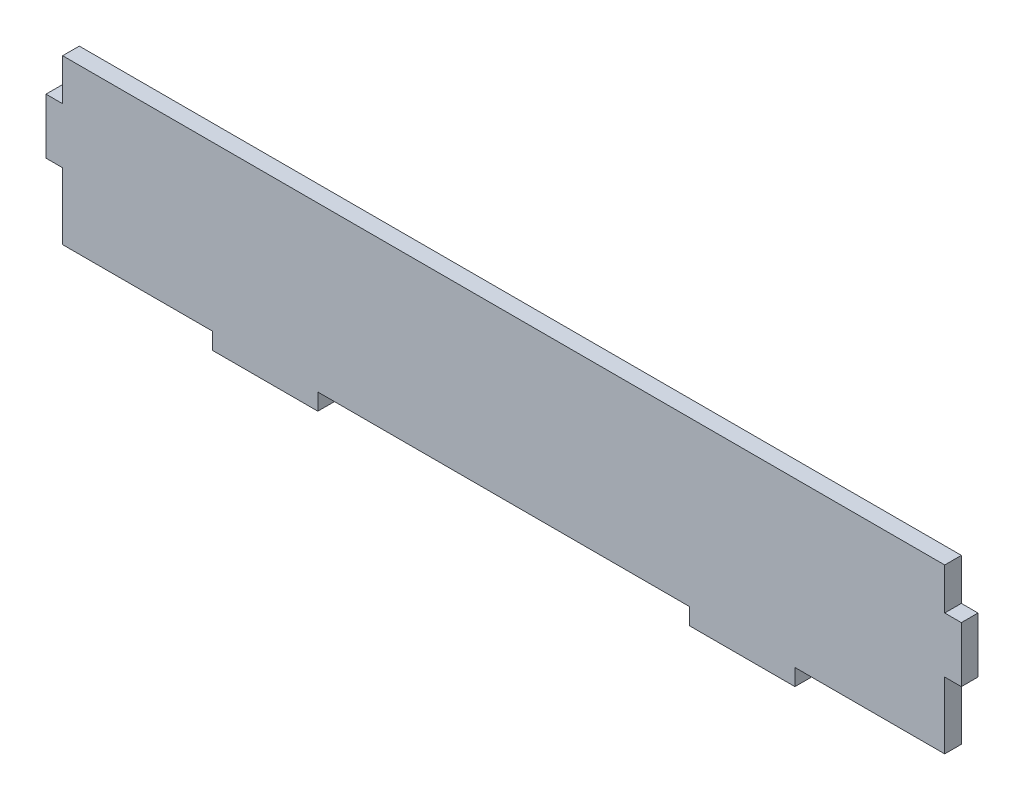
ISO-10303-21;
HEADER;
FILE_DESCRIPTION(('STEP AP214'),'2;1');
FILE_NAME('part.step','',(''),(''),'','','');
FILE_SCHEMA(('AUTOMOTIVE_DESIGN { 1 0 10303 214 1 1 1 1 }'));
ENDSEC;
DATA;
#1=APPLICATION_CONTEXT('core data for automotive mechanical design processes');
#2=APPLICATION_PROTOCOL_DEFINITION('international standard','automotive_design',2000,#1);
#3=PRODUCT_CONTEXT('',#1,'mechanical');
#4=PRODUCT('Part','Part','',(#3));
#5=PRODUCT_RELATED_PRODUCT_CATEGORY('part','',(#4));
#6=PRODUCT_DEFINITION_FORMATION('','',#4);
#7=PRODUCT_DEFINITION_CONTEXT('part definition',#1,'design');
#8=PRODUCT_DEFINITION('design','',#6,#7);
#9=PRODUCT_DEFINITION_SHAPE('','',#8);
#10=(LENGTH_UNIT() NAMED_UNIT(*) SI_UNIT(.MILLI.,.METRE.));
#11=(NAMED_UNIT(*) PLANE_ANGLE_UNIT() SI_UNIT($,.RADIAN.));
#12=(NAMED_UNIT(*) SI_UNIT($,.STERADIAN.) SOLID_ANGLE_UNIT());
#13=UNCERTAINTY_MEASURE_WITH_UNIT(LENGTH_MEASURE(1.E-05),#10,'distance_accuracy_value','');
#14=(GEOMETRIC_REPRESENTATION_CONTEXT(3) GLOBAL_UNCERTAINTY_ASSIGNED_CONTEXT((#13)) GLOBAL_UNIT_ASSIGNED_CONTEXT((#10,
#11,#12)) REPRESENTATION_CONTEXT('',''));
#15=CARTESIAN_POINT('',(0.,0.,0.));
#16=DIRECTION('',(0.,0.,1.));
#17=DIRECTION('',(1.,0.,0.));
#18=AXIS2_PLACEMENT_3D('',#15,#16,#17);
#19=CARTESIAN_POINT('',(0.,0.,6.));
#20=DIRECTION('',(0.,1.,0.));
#21=DIRECTION('',(0.,0.,1.));
#22=AXIS2_PLACEMENT_3D('',#19,#20,#21);
#23=PLANE('',#22);
#24=DIRECTION('',(1.,0.,0.));
#25=VECTOR('',#24,1.);
#26=CARTESIAN_POINT('',(0.,0.,0.));
#27=LINE('',#26,#25);
#28=CARTESIAN_POINT('',(-270.,0.,0.));
#29=VERTEX_POINT('',#28);
#30=CARTESIAN_POINT('',(-232.,0.,0.));
#31=VERTEX_POINT('',#30);
#32=EDGE_CURVE('E39',#29,#31,#27,.T.);
#33=ORIENTED_EDGE('',*,*,#32,.T.);
#34=DIRECTION('',(0.,0.,1.));
#35=VECTOR('',#34,1.);
#36=CARTESIAN_POINT('',(-232.,0.,0.));
#37=LINE('',#36,#35);
#38=CARTESIAN_POINT('',(-232.,0.,6.));
#39=VERTEX_POINT('',#38);
#40=EDGE_CURVE('E278',#31,#39,#37,.T.);
#41=ORIENTED_EDGE('',*,*,#40,.T.);
#42=DIRECTION('',(1.,0.,0.));
#43=VECTOR('',#42,1.);
#44=CARTESIAN_POINT('',(0.,0.,6.));
#45=LINE('',#44,#43);
#46=CARTESIAN_POINT('',(-270.,0.,6.));
#47=VERTEX_POINT('',#46);
#48=EDGE_CURVE('E11',#47,#39,#45,.T.);
#49=ORIENTED_EDGE('',*,*,#48,.F.);
#50=DIRECTION('',(0.,0.,1.));
#51=VECTOR('',#50,1.);
#52=CARTESIAN_POINT('',(-270.,0.,0.));
#53=LINE('',#52,#51);
#54=EDGE_CURVE('E208',#29,#47,#53,.T.);
#55=ORIENTED_EDGE('',*,*,#54,.F.);
#56=EDGE_LOOP('',(#33,#41,#49,#55));
#57=FACE_BOUND('',#56,.T.);
#58=ADVANCED_FACE('F35',(#57),#23,.F.);
#59=CARTESIAN_POINT('',(0.,0.,6.));
#60=DIRECTION('',(-1.,0.,0.));
#61=DIRECTION('',(0.,-1.,0.));
#62=AXIS2_PLACEMENT_3D('',#59,#60,#61);
#63=PLANE('',#62);
#64=DIRECTION('',(0.,1.,0.));
#65=VECTOR('',#64,1.);
#66=CARTESIAN_POINT('',(0.,0.,0.));
#67=LINE('',#66,#65);
#68=CARTESIAN_POINT('',(0.,30.,0.));
#69=VERTEX_POINT('',#68);
#70=CARTESIAN_POINT('',(0.,50.,0.));
#71=VERTEX_POINT('',#70);
#72=EDGE_CURVE('E195',#69,#71,#67,.T.);
#73=ORIENTED_EDGE('',*,*,#72,.T.);
#74=DIRECTION('',(0.,0.,1.));
#75=VECTOR('',#74,1.);
#76=CARTESIAN_POINT('',(0.,50.,0.));
#77=LINE('',#76,#75);
#78=CARTESIAN_POINT('',(0.,50.,6.));
#79=VERTEX_POINT('',#78);
#80=EDGE_CURVE('E316',#71,#79,#77,.T.);
#81=ORIENTED_EDGE('',*,*,#80,.T.);
#82=DIRECTION('',(0.,1.,0.));
#83=VECTOR('',#82,1.);
#84=CARTESIAN_POINT('',(0.,0.,6.));
#85=LINE('',#84,#83);
#86=CARTESIAN_POINT('',(0.,30.,6.));
#87=VERTEX_POINT('',#86);
#88=EDGE_CURVE('E205',#87,#79,#85,.T.);
#89=ORIENTED_EDGE('',*,*,#88,.F.);
#90=DIRECTION('',(0.,0.,1.));
#91=VECTOR('',#90,1.);
#92=CARTESIAN_POINT('',(0.,30.,0.));
#93=LINE('',#92,#91);
#94=EDGE_CURVE('E243',#69,#87,#93,.T.);
#95=ORIENTED_EDGE('',*,*,#94,.F.);
#96=EDGE_LOOP('',(#73,#81,#89,#95));
#97=FACE_BOUND('',#96,.T.);
#98=ADVANCED_FACE('F37',(#97),#63,.F.);
#99=CARTESIAN_POINT('',(0.,65.0000000000001,6.));
#100=DIRECTION('',(0.,-1.,0.));
#101=DIRECTION('',(1.,0.,0.));
#102=AXIS2_PLACEMENT_3D('',#99,#100,#101);
#103=PLANE('',#102);
#104=DIRECTION('',(-1.,0.,0.));
#105=VECTOR('',#104,1.);
#106=CARTESIAN_POINT('',(0.,65.0000000000001,6.));
#107=LINE('',#106,#105);
#108=CARTESIAN_POINT('',(-6.,65.,6.));
#109=VERTEX_POINT('',#108);
#110=CARTESIAN_POINT('',(-324.,65.,6.));
#111=VERTEX_POINT('',#110);
#112=EDGE_CURVE('E190',#109,#111,#107,.T.);
#113=ORIENTED_EDGE('',*,*,#112,.F.);
#114=DIRECTION('',(0.,0.,1.));
#115=VECTOR('',#114,1.);
#116=CARTESIAN_POINT('',(-6.,65.,0.));
#117=LINE('',#116,#115);
#118=CARTESIAN_POINT('',(-6.,65.,0.));
#119=VERTEX_POINT('',#118);
#120=EDGE_CURVE('E178',#119,#109,#117,.T.);
#121=ORIENTED_EDGE('',*,*,#120,.F.);
#122=DIRECTION('',(-1.,0.,0.));
#123=VECTOR('',#122,1.);
#124=CARTESIAN_POINT('',(0.,65.0000000000001,0.));
#125=LINE('',#124,#123);
#126=CARTESIAN_POINT('',(-324.,65.,0.));
#127=VERTEX_POINT('',#126);
#128=EDGE_CURVE('E189',#119,#127,#125,.T.);
#129=ORIENTED_EDGE('',*,*,#128,.T.);
#130=DIRECTION('',(0.,0.,1.));
#131=VECTOR('',#130,1.);
#132=CARTESIAN_POINT('',(-324.,65.,0.));
#133=LINE('',#132,#131);
#134=EDGE_CURVE('E296',#127,#111,#133,.T.);
#135=ORIENTED_EDGE('',*,*,#134,.T.);
#136=EDGE_LOOP('',(#113,#121,#129,#135));
#137=FACE_BOUND('',#136,.T.);
#138=ADVANCED_FACE('F187',(#137),#103,.F.);
#139=CARTESIAN_POINT('',(-330.,0.,6.));
#140=DIRECTION('',(1.,0.,0.));
#141=DIRECTION('',(0.,0.,-1.));
#142=AXIS2_PLACEMENT_3D('',#139,#140,#141);
#143=PLANE('',#142);
#144=DIRECTION('',(0.,-1.,0.));
#145=VECTOR('',#144,1.);
#146=CARTESIAN_POINT('',(-330.,0.,6.));
#147=LINE('',#146,#145);
#148=CARTESIAN_POINT('',(-330.,50.,6.));
#149=VERTEX_POINT('',#148);
#150=CARTESIAN_POINT('',(-330.,30.,6.));
#151=VERTEX_POINT('',#150);
#152=EDGE_CURVE('E202',#149,#151,#147,.T.);
#153=ORIENTED_EDGE('',*,*,#152,.F.);
#154=DIRECTION('',(0.,0.,1.));
#155=VECTOR('',#154,1.);
#156=CARTESIAN_POINT('',(-330.,50.,0.));
#157=LINE('',#156,#155);
#158=CARTESIAN_POINT('',(-330.,50.,0.));
#159=VERTEX_POINT('',#158);
#160=EDGE_CURVE('E304',#159,#149,#157,.T.);
#161=ORIENTED_EDGE('',*,*,#160,.F.);
#162=DIRECTION('',(0.,-1.,0.));
#163=VECTOR('',#162,1.);
#164=CARTESIAN_POINT('',(-330.,0.,0.));
#165=LINE('',#164,#163);
#166=CARTESIAN_POINT('',(-330.,30.,0.));
#167=VERTEX_POINT('',#166);
#168=EDGE_CURVE('E194',#159,#167,#165,.T.);
#169=ORIENTED_EDGE('',*,*,#168,.T.);
#170=DIRECTION('',(0.,0.,1.));
#171=VECTOR('',#170,1.);
#172=CARTESIAN_POINT('',(-330.,30.,0.));
#173=LINE('',#172,#171);
#174=EDGE_CURVE('E199',#167,#151,#173,.T.);
#175=ORIENTED_EDGE('',*,*,#174,.T.);
#176=EDGE_LOOP('',(#153,#161,#169,#175));
#177=FACE_BOUND('',#176,.T.);
#178=ADVANCED_FACE('F383',(#177),#143,.F.);
#179=CARTESIAN_POINT('',(-98.,0.,6.));
#180=VERTEX_POINT('',#179);
#181=CARTESIAN_POINT('',(-60.,0.,6.));
#182=VERTEX_POINT('',#181);
#183=EDGE_CURVE('E44',#180,#182,#45,.T.);
#184=ORIENTED_EDGE('',*,*,#183,.F.);
#185=DIRECTION('',(0.,0.,1.));
#186=VECTOR('',#185,1.);
#187=CARTESIAN_POINT('',(-98.,0.,0.));
#188=LINE('',#187,#186);
#189=CARTESIAN_POINT('',(-98.,0.,0.));
#190=VERTEX_POINT('',#189);
#191=EDGE_CURVE('E281',#190,#180,#188,.T.);
#192=ORIENTED_EDGE('',*,*,#191,.F.);
#193=CARTESIAN_POINT('',(-60.,0.,0.));
#194=VERTEX_POINT('',#193);
#195=EDGE_CURVE('E197',#190,#194,#27,.T.);
#196=ORIENTED_EDGE('',*,*,#195,.T.);
#197=DIRECTION('',(0.,0.,1.));
#198=VECTOR('',#197,1.);
#199=CARTESIAN_POINT('',(-60.,0.,0.));
#200=LINE('',#199,#198);
#201=EDGE_CURVE('E232',#194,#182,#200,.T.);
#202=ORIENTED_EDGE('',*,*,#201,.T.);
#203=EDGE_LOOP('',(#184,#192,#196,#202));
#204=FACE_BOUND('',#203,.T.);
#205=ADVANCED_FACE('F351',(#204),#23,.F.);
#206=CARTESIAN_POINT('',(0.,0.,6.));
#207=DIRECTION('',(0.,0.,1.));
#208=DIRECTION('',(1.,0.,0.));
#209=AXIS2_PLACEMENT_3D('',#206,#207,#208);
#210=PLANE('',#209);
#211=DIRECTION('',(1.,0.,0.));
#212=VECTOR('',#211,1.);
#213=CARTESIAN_POINT('',(0.,50.,6.));
#214=LINE('',#213,#212);
#215=CARTESIAN_POINT('',(-6.,50.,6.));
#216=VERTEX_POINT('',#215);
#217=EDGE_CURVE('E183',#216,#79,#214,.T.);
#218=ORIENTED_EDGE('',*,*,#217,.F.);
#219=DIRECTION('',(0.,-1.,0.));
#220=VECTOR('',#219,1.);
#221=CARTESIAN_POINT('',(-6.,65.,6.));
#222=LINE('',#221,#220);
#223=EDGE_CURVE('E323',#109,#216,#222,.T.);
#224=ORIENTED_EDGE('',*,*,#223,.F.);
#225=ORIENTED_EDGE('',*,*,#112,.T.);
#226=DIRECTION('',(0.,1.,0.));
#227=VECTOR('',#226,1.);
#228=CARTESIAN_POINT('',(-324.,65.,6.));
#229=LINE('',#228,#227);
#230=CARTESIAN_POINT('',(-324.,50.,6.));
#231=VERTEX_POINT('',#230);
#232=EDGE_CURVE('E309',#231,#111,#229,.T.);
#233=ORIENTED_EDGE('',*,*,#232,.F.);
#234=DIRECTION('',(1.,0.,0.));
#235=VECTOR('',#234,1.);
#236=CARTESIAN_POINT('',(-330.,50.,6.));
#237=LINE('',#236,#235);
#238=EDGE_CURVE('E313',#149,#231,#237,.T.);
#239=ORIENTED_EDGE('',*,*,#238,.F.);
#240=ORIENTED_EDGE('',*,*,#152,.T.);
#241=DIRECTION('',(-1.,0.,0.));
#242=VECTOR('',#241,1.);
#243=CARTESIAN_POINT('',(-330.,30.,6.));
#244=LINE('',#243,#242);
#245=CARTESIAN_POINT('',(-324.,30.,6.));
#246=VERTEX_POINT('',#245);
#247=EDGE_CURVE('E219',#246,#151,#244,.T.);
#248=ORIENTED_EDGE('',*,*,#247,.F.);
#249=DIRECTION('',(0.,1.,0.));
#250=VECTOR('',#249,1.);
#251=CARTESIAN_POINT('',(-324.,6.,6.));
#252=LINE('',#251,#250);
#253=CARTESIAN_POINT('',(-324.,6.,6.));
#254=VERTEX_POINT('',#253);
#255=EDGE_CURVE('E223',#254,#246,#252,.T.);
#256=ORIENTED_EDGE('',*,*,#255,.F.);
#257=DIRECTION('',(-1.,0.,0.));
#258=VECTOR('',#257,1.);
#259=CARTESIAN_POINT('',(-324.,6.,6.));
#260=LINE('',#259,#258);
#261=CARTESIAN_POINT('',(-270.,6.,6.));
#262=VERTEX_POINT('',#261);
#263=EDGE_CURVE('E226',#262,#254,#260,.T.);
#264=ORIENTED_EDGE('',*,*,#263,.F.);
#265=DIRECTION('',(0.,1.,0.));
#266=VECTOR('',#265,1.);
#267=CARTESIAN_POINT('',(-270.,0.,6.));
#268=LINE('',#267,#266);
#269=EDGE_CURVE('E229',#47,#262,#268,.T.);
#270=ORIENTED_EDGE('',*,*,#269,.F.);
#271=ORIENTED_EDGE('',*,*,#48,.T.);
#272=DIRECTION('',(0.,-1.,0.));
#273=VECTOR('',#272,1.);
#274=CARTESIAN_POINT('',(-232.,0.,6.));
#275=LINE('',#274,#273);
#276=CARTESIAN_POINT('',(-232.,6.,6.));
#277=VERTEX_POINT('',#276);
#278=EDGE_CURVE('E294',#277,#39,#275,.T.);
#279=ORIENTED_EDGE('',*,*,#278,.F.);
#280=DIRECTION('',(-1.,0.,0.));
#281=VECTOR('',#280,1.);
#282=CARTESIAN_POINT('',(-232.,6.,6.));
#283=LINE('',#282,#281);
#284=CARTESIAN_POINT('',(-98.,6.,6.));
#285=VERTEX_POINT('',#284);
#286=EDGE_CURVE('E287',#285,#277,#283,.T.);
#287=ORIENTED_EDGE('',*,*,#286,.F.);
#288=DIRECTION('',(0.,1.,0.));
#289=VECTOR('',#288,1.);
#290=CARTESIAN_POINT('',(-98.,0.,6.));
#291=LINE('',#290,#289);
#292=EDGE_CURVE('E291',#180,#285,#291,.T.);
#293=ORIENTED_EDGE('',*,*,#292,.F.);
#294=ORIENTED_EDGE('',*,*,#183,.T.);
#295=DIRECTION('',(0.,-1.,0.));
#296=VECTOR('',#295,1.);
#297=CARTESIAN_POINT('',(-60.,0.,6.));
#298=LINE('',#297,#296);
#299=CARTESIAN_POINT('',(-60.,5.99999999999999,6.));
#300=VERTEX_POINT('',#299);
#301=EDGE_CURVE('E254',#300,#182,#298,.T.);
#302=ORIENTED_EDGE('',*,*,#301,.F.);
#303=DIRECTION('',(-1.,0.,0.));
#304=VECTOR('',#303,1.);
#305=CARTESIAN_POINT('',(-6.,6.,6.));
#306=LINE('',#305,#304);
#307=CARTESIAN_POINT('',(-6.,6.,6.));
#308=VERTEX_POINT('',#307);
#309=EDGE_CURVE('E258',#308,#300,#306,.T.);
#310=ORIENTED_EDGE('',*,*,#309,.F.);
#311=DIRECTION('',(0.,-1.,0.));
#312=VECTOR('',#311,1.);
#313=CARTESIAN_POINT('',(-6.,6.,6.));
#314=LINE('',#313,#312);
#315=CARTESIAN_POINT('',(-6.,30.,6.));
#316=VERTEX_POINT('',#315);
#317=EDGE_CURVE('E261',#316,#308,#314,.T.);
#318=ORIENTED_EDGE('',*,*,#317,.F.);
#319=DIRECTION('',(-1.,0.,0.));
#320=VECTOR('',#319,1.);
#321=CARTESIAN_POINT('',(0.,30.,6.));
#322=LINE('',#321,#320);
#323=EDGE_CURVE('E264',#87,#316,#322,.T.);
#324=ORIENTED_EDGE('',*,*,#323,.F.);
#325=ORIENTED_EDGE('',*,*,#88,.T.);
#326=EDGE_LOOP('',(#218,#224,#225,#233,#239,#240,#248,#256,#264,#270,#271,#279,#287,#293,#294,
#302,#310,#318,#324,#325));
#327=FACE_BOUND('',#326,.T.);
#328=ADVANCED_FACE('F336',(#327),#210,.T.);
#329=CARTESIAN_POINT('',(0.,0.,0.));
#330=DIRECTION('',(0.,0.,1.));
#331=DIRECTION('',(1.,0.,0.));
#332=AXIS2_PLACEMENT_3D('',#329,#330,#331);
#333=PLANE('',#332);
#334=DIRECTION('',(0.,-1.,0.));
#335=VECTOR('',#334,1.);
#336=CARTESIAN_POINT('',(-6.,65.,0.));
#337=LINE('',#336,#335);
#338=CARTESIAN_POINT('',(-6.,50.,0.));
#339=VERTEX_POINT('',#338);
#340=EDGE_CURVE('E174',#119,#339,#337,.T.);
#341=ORIENTED_EDGE('',*,*,#340,.T.);
#342=DIRECTION('',(1.,0.,0.));
#343=VECTOR('',#342,1.);
#344=CARTESIAN_POINT('',(0.,50.,0.));
#345=LINE('',#344,#343);
#346=EDGE_CURVE('E52',#339,#71,#345,.T.);
#347=ORIENTED_EDGE('',*,*,#346,.T.);
#348=ORIENTED_EDGE('',*,*,#72,.F.);
#349=DIRECTION('',(-1.,0.,0.));
#350=VECTOR('',#349,1.);
#351=CARTESIAN_POINT('',(0.,30.,0.));
#352=LINE('',#351,#350);
#353=CARTESIAN_POINT('',(-6.,30.,0.));
#354=VERTEX_POINT('',#353);
#355=EDGE_CURVE('E257',#69,#354,#352,.T.);
#356=ORIENTED_EDGE('',*,*,#355,.T.);
#357=DIRECTION('',(0.,-1.,0.));
#358=VECTOR('',#357,1.);
#359=CARTESIAN_POINT('',(-6.,6.,0.));
#360=LINE('',#359,#358);
#361=CARTESIAN_POINT('',(-6.,6.,0.));
#362=VERTEX_POINT('',#361);
#363=EDGE_CURVE('E273',#354,#362,#360,.T.);
#364=ORIENTED_EDGE('',*,*,#363,.T.);
#365=DIRECTION('',(-1.,0.,0.));
#366=VECTOR('',#365,1.);
#367=CARTESIAN_POINT('',(-6.,6.,0.));
#368=LINE('',#367,#366);
#369=CARTESIAN_POINT('',(-60.,5.99999999999999,0.));
#370=VERTEX_POINT('',#369);
#371=EDGE_CURVE('E270',#362,#370,#368,.T.);
#372=ORIENTED_EDGE('',*,*,#371,.T.);
#373=DIRECTION('',(0.,-1.,0.));
#374=VECTOR('',#373,1.);
#375=CARTESIAN_POINT('',(-60.,0.,0.));
#376=LINE('',#375,#374);
#377=EDGE_CURVE('E246',#370,#194,#376,.T.);
#378=ORIENTED_EDGE('',*,*,#377,.T.);
#379=ORIENTED_EDGE('',*,*,#195,.F.);
#380=DIRECTION('',(0.,1.,0.));
#381=VECTOR('',#380,1.);
#382=CARTESIAN_POINT('',(-98.,0.,0.));
#383=LINE('',#382,#381);
#384=CARTESIAN_POINT('',(-98.,6.,0.));
#385=VERTEX_POINT('',#384);
#386=EDGE_CURVE('E299',#190,#385,#383,.T.);
#387=ORIENTED_EDGE('',*,*,#386,.T.);
#388=DIRECTION('',(-1.,0.,0.));
#389=VECTOR('',#388,1.);
#390=CARTESIAN_POINT('',(-232.,6.,0.));
#391=LINE('',#390,#389);
#392=CARTESIAN_POINT('',(-232.,6.,0.));
#393=VERTEX_POINT('',#392);
#394=EDGE_CURVE('E282',#385,#393,#391,.T.);
#395=ORIENTED_EDGE('',*,*,#394,.T.);
#396=DIRECTION('',(0.,-1.,0.));
#397=VECTOR('',#396,1.);
#398=CARTESIAN_POINT('',(-232.,0.,0.));
#399=LINE('',#398,#397);
#400=EDGE_CURVE('E290',#393,#31,#399,.T.);
#401=ORIENTED_EDGE('',*,*,#400,.T.);
#402=ORIENTED_EDGE('',*,*,#32,.F.);
#403=DIRECTION('',(0.,1.,0.));
#404=VECTOR('',#403,1.);
#405=CARTESIAN_POINT('',(-270.,0.,0.));
#406=LINE('',#405,#404);
#407=CARTESIAN_POINT('',(-270.,6.,0.));
#408=VERTEX_POINT('',#407);
#409=EDGE_CURVE('E222',#29,#408,#406,.T.);
#410=ORIENTED_EDGE('',*,*,#409,.T.);
#411=DIRECTION('',(-1.,0.,0.));
#412=VECTOR('',#411,1.);
#413=CARTESIAN_POINT('',(-324.,6.,0.));
#414=LINE('',#413,#412);
#415=CARTESIAN_POINT('',(-324.,6.,0.));
#416=VERTEX_POINT('',#415);
#417=EDGE_CURVE('E238',#408,#416,#414,.T.);
#418=ORIENTED_EDGE('',*,*,#417,.T.);
#419=DIRECTION('',(0.,1.,0.));
#420=VECTOR('',#419,1.);
#421=CARTESIAN_POINT('',(-324.,6.,0.));
#422=LINE('',#421,#420);
#423=CARTESIAN_POINT('',(-324.,30.,0.));
#424=VERTEX_POINT('',#423);
#425=EDGE_CURVE('E235',#416,#424,#422,.T.);
#426=ORIENTED_EDGE('',*,*,#425,.T.);
#427=DIRECTION('',(-1.,0.,0.));
#428=VECTOR('',#427,1.);
#429=CARTESIAN_POINT('',(-330.,30.,0.));
#430=LINE('',#429,#428);
#431=EDGE_CURVE('E211',#424,#167,#430,.T.);
#432=ORIENTED_EDGE('',*,*,#431,.T.);
#433=ORIENTED_EDGE('',*,*,#168,.F.);
#434=DIRECTION('',(1.,0.,0.));
#435=VECTOR('',#434,1.);
#436=CARTESIAN_POINT('',(-330.,50.,0.));
#437=LINE('',#436,#435);
#438=CARTESIAN_POINT('',(-324.,50.,0.));
#439=VERTEX_POINT('',#438);
#440=EDGE_CURVE('E312',#159,#439,#437,.T.);
#441=ORIENTED_EDGE('',*,*,#440,.T.);
#442=DIRECTION('',(0.,1.,0.));
#443=VECTOR('',#442,1.);
#444=CARTESIAN_POINT('',(-324.,65.,0.));
#445=LINE('',#444,#443);
#446=EDGE_CURVE('E60',#439,#127,#445,.T.);
#447=ORIENTED_EDGE('',*,*,#446,.T.);
#448=ORIENTED_EDGE('',*,*,#128,.F.);
#449=EDGE_LOOP('',(#341,#347,#348,#356,#364,#372,#378,#379,#387,#395,#401,#402,#410,#418,#426,
#432,#433,#441,#447,#448));
#450=FACE_BOUND('',#449,.T.);
#451=ADVANCED_FACE('F192',(#450),#333,.F.);
#452=CARTESIAN_POINT('',(-330.,30.,0.));
#453=DIRECTION('',(0.,1.,0.));
#454=DIRECTION('',(0.,0.,1.));
#455=AXIS2_PLACEMENT_3D('',#452,#453,#454);
#456=PLANE('',#455);
#457=ORIENTED_EDGE('',*,*,#247,.T.);
#458=ORIENTED_EDGE('',*,*,#174,.F.);
#459=ORIENTED_EDGE('',*,*,#431,.F.);
#460=DIRECTION('',(0.,0.,1.));
#461=VECTOR('',#460,1.);
#462=CARTESIAN_POINT('',(-324.,30.,0.));
#463=LINE('',#462,#461);
#464=EDGE_CURVE('E215',#424,#246,#463,.T.);
#465=ORIENTED_EDGE('',*,*,#464,.T.);
#466=EDGE_LOOP('',(#457,#458,#459,#465));
#467=FACE_BOUND('',#466,.T.);
#468=ADVANCED_FACE('F380',(#467),#456,.F.);
#469=CARTESIAN_POINT('',(-324.,6.,0.));
#470=DIRECTION('',(1.,0.,0.));
#471=DIRECTION('',(0.,0.,-1.));
#472=AXIS2_PLACEMENT_3D('',#469,#470,#471);
#473=PLANE('',#472);
#474=ORIENTED_EDGE('',*,*,#255,.T.);
#475=ORIENTED_EDGE('',*,*,#464,.F.);
#476=ORIENTED_EDGE('',*,*,#425,.F.);
#477=DIRECTION('',(0.,0.,1.));
#478=VECTOR('',#477,1.);
#479=CARTESIAN_POINT('',(-324.,6.,0.));
#480=LINE('',#479,#478);
#481=EDGE_CURVE('E213',#416,#254,#480,.T.);
#482=ORIENTED_EDGE('',*,*,#481,.T.);
#483=EDGE_LOOP('',(#474,#475,#476,#482));
#484=FACE_BOUND('',#483,.T.);
#485=ADVANCED_FACE('F376',(#484),#473,.F.);
#486=CARTESIAN_POINT('',(-324.,6.,0.));
#487=DIRECTION('',(0.,1.,0.));
#488=DIRECTION('',(0.,0.,1.));
#489=AXIS2_PLACEMENT_3D('',#486,#487,#488);
#490=PLANE('',#489);
#491=ORIENTED_EDGE('',*,*,#263,.T.);
#492=ORIENTED_EDGE('',*,*,#481,.F.);
#493=ORIENTED_EDGE('',*,*,#417,.F.);
#494=DIRECTION('',(0.,0.,1.));
#495=VECTOR('',#494,1.);
#496=CARTESIAN_POINT('',(-270.,6.,0.));
#497=LINE('',#496,#495);
#498=EDGE_CURVE('E210',#408,#262,#497,.T.);
#499=ORIENTED_EDGE('',*,*,#498,.T.);
#500=EDGE_LOOP('',(#491,#492,#493,#499));
#501=FACE_BOUND('',#500,.T.);
#502=ADVANCED_FACE('F371',(#501),#490,.F.);
#503=CARTESIAN_POINT('',(-270.,0.,0.));
#504=DIRECTION('',(1.,0.,0.));
#505=DIRECTION('',(0.,0.,-1.));
#506=AXIS2_PLACEMENT_3D('',#503,#504,#505);
#507=PLANE('',#506);
#508=ORIENTED_EDGE('',*,*,#269,.T.);
#509=ORIENTED_EDGE('',*,*,#498,.F.);
#510=ORIENTED_EDGE('',*,*,#409,.F.);
#511=ORIENTED_EDGE('',*,*,#54,.T.);
#512=EDGE_LOOP('',(#508,#509,#510,#511));
#513=FACE_BOUND('',#512,.T.);
#514=ADVANCED_FACE('F369',(#513),#507,.F.);
#515=CARTESIAN_POINT('',(-60.,0.,0.));
#516=DIRECTION('',(-1.,0.,0.));
#517=DIRECTION('',(0.,0.,1.));
#518=AXIS2_PLACEMENT_3D('',#515,#516,#517);
#519=PLANE('',#518);
#520=ORIENTED_EDGE('',*,*,#301,.T.);
#521=ORIENTED_EDGE('',*,*,#201,.F.);
#522=ORIENTED_EDGE('',*,*,#377,.F.);
#523=DIRECTION('',(0.,0.,1.));
#524=VECTOR('',#523,1.);
#525=CARTESIAN_POINT('',(-60.,5.99999999999999,0.));
#526=LINE('',#525,#524);
#527=EDGE_CURVE('E250',#370,#300,#526,.T.);
#528=ORIENTED_EDGE('',*,*,#527,.T.);
#529=EDGE_LOOP('',(#520,#521,#522,#528));
#530=FACE_BOUND('',#529,.T.);
#531=ADVANCED_FACE('F348',(#530),#519,.F.);
#532=CARTESIAN_POINT('',(-6.,6.,0.));
#533=DIRECTION('',(0.,1.,0.));
#534=DIRECTION('',(-1.,0.,0.));
#535=AXIS2_PLACEMENT_3D('',#532,#533,#534);
#536=PLANE('',#535);
#537=ORIENTED_EDGE('',*,*,#309,.T.);
#538=ORIENTED_EDGE('',*,*,#527,.F.);
#539=ORIENTED_EDGE('',*,*,#371,.F.);
#540=DIRECTION('',(0.,0.,1.));
#541=VECTOR('',#540,1.);
#542=CARTESIAN_POINT('',(-6.,6.,0.));
#543=LINE('',#542,#541);
#544=EDGE_CURVE('E248',#362,#308,#543,.T.);
#545=ORIENTED_EDGE('',*,*,#544,.T.);
#546=EDGE_LOOP('',(#537,#538,#539,#545));
#547=FACE_BOUND('',#546,.T.);
#548=ADVANCED_FACE('F345',(#547),#536,.F.);
#549=CARTESIAN_POINT('',(-6.,6.,0.));
#550=DIRECTION('',(-1.,0.,0.));
#551=DIRECTION('',(0.,0.,1.));
#552=AXIS2_PLACEMENT_3D('',#549,#550,#551);
#553=PLANE('',#552);
#554=ORIENTED_EDGE('',*,*,#317,.T.);
#555=ORIENTED_EDGE('',*,*,#544,.F.);
#556=ORIENTED_EDGE('',*,*,#363,.F.);
#557=DIRECTION('',(0.,0.,1.));
#558=VECTOR('',#557,1.);
#559=CARTESIAN_POINT('',(-6.,30.,0.));
#560=LINE('',#559,#558);
#561=EDGE_CURVE('E245',#354,#316,#560,.T.);
#562=ORIENTED_EDGE('',*,*,#561,.T.);
#563=EDGE_LOOP('',(#554,#555,#556,#562));
#564=FACE_BOUND('',#563,.T.);
#565=ADVANCED_FACE('F340',(#564),#553,.F.);
#566=CARTESIAN_POINT('',(0.,30.,0.));
#567=DIRECTION('',(0.,1.,0.));
#568=DIRECTION('',(-1.,0.,0.));
#569=AXIS2_PLACEMENT_3D('',#566,#567,#568);
#570=PLANE('',#569);
#571=ORIENTED_EDGE('',*,*,#323,.T.);
#572=ORIENTED_EDGE('',*,*,#561,.F.);
#573=ORIENTED_EDGE('',*,*,#355,.F.);
#574=ORIENTED_EDGE('',*,*,#94,.T.);
#575=EDGE_LOOP('',(#571,#572,#573,#574));
#576=FACE_BOUND('',#575,.T.);
#577=ADVANCED_FACE('F331',(#576),#570,.F.);
#578=CARTESIAN_POINT('',(-232.,0.,0.));
#579=DIRECTION('',(-1.,0.,0.));
#580=DIRECTION('',(0.,0.,1.));
#581=AXIS2_PLACEMENT_3D('',#578,#579,#580);
#582=PLANE('',#581);
#583=ORIENTED_EDGE('',*,*,#278,.T.);
#584=ORIENTED_EDGE('',*,*,#40,.F.);
#585=ORIENTED_EDGE('',*,*,#400,.F.);
#586=DIRECTION('',(0.,0.,1.));
#587=VECTOR('',#586,1.);
#588=CARTESIAN_POINT('',(-232.,6.,0.));
#589=LINE('',#588,#587);
#590=EDGE_CURVE('E267',#393,#277,#589,.T.);
#591=ORIENTED_EDGE('',*,*,#590,.T.);
#592=EDGE_LOOP('',(#583,#584,#585,#591));
#593=FACE_BOUND('',#592,.T.);
#594=ADVANCED_FACE('F360',(#593),#582,.F.);
#595=CARTESIAN_POINT('',(-232.,6.,0.));
#596=DIRECTION('',(0.,1.,0.));
#597=DIRECTION('',(0.,0.,1.));
#598=AXIS2_PLACEMENT_3D('',#595,#596,#597);
#599=PLANE('',#598);
#600=ORIENTED_EDGE('',*,*,#286,.T.);
#601=ORIENTED_EDGE('',*,*,#590,.F.);
#602=ORIENTED_EDGE('',*,*,#394,.F.);
#603=DIRECTION('',(0.,0.,1.));
#604=VECTOR('',#603,1.);
#605=CARTESIAN_POINT('',(-98.,6.,0.));
#606=LINE('',#605,#604);
#607=EDGE_CURVE('E284',#385,#285,#606,.T.);
#608=ORIENTED_EDGE('',*,*,#607,.T.);
#609=EDGE_LOOP('',(#600,#601,#602,#608));
#610=FACE_BOUND('',#609,.T.);
#611=ADVANCED_FACE('F496',(#610),#599,.F.);
#612=CARTESIAN_POINT('',(-98.,0.,0.));
#613=DIRECTION('',(1.,0.,0.));
#614=DIRECTION('',(0.,0.,-1.));
#615=AXIS2_PLACEMENT_3D('',#612,#613,#614);
#616=PLANE('',#615);
#617=ORIENTED_EDGE('',*,*,#292,.T.);
#618=ORIENTED_EDGE('',*,*,#607,.F.);
#619=ORIENTED_EDGE('',*,*,#386,.F.);
#620=ORIENTED_EDGE('',*,*,#191,.T.);
#621=EDGE_LOOP('',(#617,#618,#619,#620));
#622=FACE_BOUND('',#621,.T.);
#623=ADVANCED_FACE('F504',(#622),#616,.F.);
#624=CARTESIAN_POINT('',(-324.,65.,0.));
#625=DIRECTION('',(1.,0.,0.));
#626=DIRECTION('',(0.,0.,-1.));
#627=AXIS2_PLACEMENT_3D('',#624,#625,#626);
#628=PLANE('',#627);
#629=ORIENTED_EDGE('',*,*,#232,.T.);
#630=ORIENTED_EDGE('',*,*,#134,.F.);
#631=ORIENTED_EDGE('',*,*,#446,.F.);
#632=DIRECTION('',(0.,0.,1.));
#633=VECTOR('',#632,1.);
#634=CARTESIAN_POINT('',(-324.,50.,0.));
#635=LINE('',#634,#633);
#636=EDGE_CURVE('E306',#439,#231,#635,.T.);
#637=ORIENTED_EDGE('',*,*,#636,.T.);
#638=EDGE_LOOP('',(#629,#630,#631,#637));
#639=FACE_BOUND('',#638,.T.);
#640=ADVANCED_FACE('F389',(#639),#628,.F.);
#641=CARTESIAN_POINT('',(-330.,50.,0.));
#642=DIRECTION('',(0.,-1.,0.));
#643=DIRECTION('',(0.,0.,-1.));
#644=AXIS2_PLACEMENT_3D('',#641,#642,#643);
#645=PLANE('',#644);
#646=ORIENTED_EDGE('',*,*,#238,.T.);
#647=ORIENTED_EDGE('',*,*,#636,.F.);
#648=ORIENTED_EDGE('',*,*,#440,.F.);
#649=ORIENTED_EDGE('',*,*,#160,.T.);
#650=EDGE_LOOP('',(#646,#647,#648,#649));
#651=FACE_BOUND('',#650,.T.);
#652=ADVANCED_FACE('F386',(#651),#645,.F.);
#653=CARTESIAN_POINT('',(0.,50.,0.));
#654=DIRECTION('',(0.,-1.,0.));
#655=DIRECTION('',(0.,0.,-1.));
#656=AXIS2_PLACEMENT_3D('',#653,#654,#655);
#657=PLANE('',#656);
#658=ORIENTED_EDGE('',*,*,#217,.T.);
#659=ORIENTED_EDGE('',*,*,#80,.F.);
#660=ORIENTED_EDGE('',*,*,#346,.F.);
#661=DIRECTION('',(0.,0.,1.));
#662=VECTOR('',#661,1.);
#663=CARTESIAN_POINT('',(-6.,50.,0.));
#664=LINE('',#663,#662);
#665=EDGE_CURVE('E180',#339,#216,#664,.T.);
#666=ORIENTED_EDGE('',*,*,#665,.T.);
#667=EDGE_LOOP('',(#658,#659,#660,#666));
#668=FACE_BOUND('',#667,.T.);
#669=ADVANCED_FACE('F390',(#668),#657,.F.);
#670=CARTESIAN_POINT('',(-6.,65.,0.));
#671=DIRECTION('',(-1.,0.,0.));
#672=DIRECTION('',(0.,-1.,0.));
#673=AXIS2_PLACEMENT_3D('',#670,#671,#672);
#674=PLANE('',#673);
#675=ORIENTED_EDGE('',*,*,#223,.T.);
#676=ORIENTED_EDGE('',*,*,#665,.F.);
#677=ORIENTED_EDGE('',*,*,#340,.F.);
#678=ORIENTED_EDGE('',*,*,#120,.T.);
#679=EDGE_LOOP('',(#675,#676,#677,#678));
#680=FACE_BOUND('',#679,.T.);
#681=ADVANCED_FACE('F177',(#680),#674,.F.);
#682=CLOSED_SHELL('',(#58,#98,#138,#178,#205,#328,#451,#468,#485,#502,#514,#531,#548,#565,#577,
#594,#611,#623,#640,#652,#669,#681));
#683=MANIFOLD_SOLID_BREP('B2',#682);
#684=ADVANCED_BREP_SHAPE_REPRESENTATION('',(#18,#683),#14);
#685=SHAPE_DEFINITION_REPRESENTATION(#9,#684);
ENDSEC;
END-ISO-10303-21;
